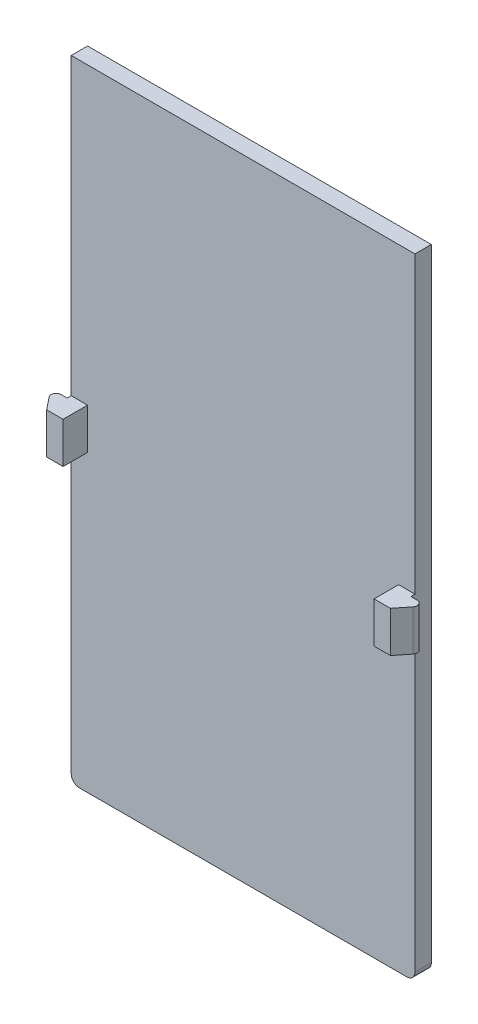
ISO-10303-21;
HEADER;
FILE_DESCRIPTION(('STEP AP214'),'2;1');
FILE_NAME('part.step','',(''),(''),'','','');
FILE_SCHEMA(('AUTOMOTIVE_DESIGN { 1 0 10303 214 1 1 1 1 }'));
ENDSEC;
DATA;
#1=APPLICATION_CONTEXT('core data for automotive mechanical design processes');
#2=APPLICATION_PROTOCOL_DEFINITION('international standard','automotive_design',2000,#1);
#3=PRODUCT_CONTEXT('',#1,'mechanical');
#4=PRODUCT('Part','Part','',(#3));
#5=PRODUCT_RELATED_PRODUCT_CATEGORY('part','',(#4));
#6=PRODUCT_DEFINITION_FORMATION('','',#4);
#7=PRODUCT_DEFINITION_CONTEXT('part definition',#1,'design');
#8=PRODUCT_DEFINITION('design','',#6,#7);
#9=PRODUCT_DEFINITION_SHAPE('','',#8);
#10=(LENGTH_UNIT() NAMED_UNIT(*) SI_UNIT(.MILLI.,.METRE.));
#11=(NAMED_UNIT(*) PLANE_ANGLE_UNIT() SI_UNIT($,.RADIAN.));
#12=(NAMED_UNIT(*) SI_UNIT($,.STERADIAN.) SOLID_ANGLE_UNIT());
#13=UNCERTAINTY_MEASURE_WITH_UNIT(LENGTH_MEASURE(1.E-05),#10,'distance_accuracy_value','');
#14=(GEOMETRIC_REPRESENTATION_CONTEXT(3) GLOBAL_UNCERTAINTY_ASSIGNED_CONTEXT((#13)) GLOBAL_UNIT_ASSIGNED_CONTEXT((#10,
#11,#12)) REPRESENTATION_CONTEXT('',''));
#15=CARTESIAN_POINT('',(0.,0.,0.));
#16=DIRECTION('',(0.,0.,1.));
#17=DIRECTION('',(1.,0.,0.));
#18=AXIS2_PLACEMENT_3D('',#15,#16,#17);
#19=CARTESIAN_POINT('',(0.,0.,2.));
#20=DIRECTION('',(0.,0.,1.));
#21=DIRECTION('',(1.,0.,0.));
#22=AXIS2_PLACEMENT_3D('',#19,#20,#21);
#23=PLANE('',#22);
#24=DIRECTION('',(0.,-1.,0.));
#25=VECTOR('',#24,1.);
#26=CARTESIAN_POINT('',(2.,-2.,2.));
#27=LINE('',#26,#25);
#28=CARTESIAN_POINT('',(2.,-41.,2.));
#29=VERTEX_POINT('',#28);
#30=CARTESIAN_POINT('',(2.00000000000001,-76.,2.));
#31=VERTEX_POINT('',#30);
#32=EDGE_CURVE('E211',#29,#31,#27,.T.);
#33=ORIENTED_EDGE('',*,*,#32,.T.);
#34=CARTESIAN_POINT('',(3.00000000000004,-76.,2.));
#35=DIRECTION('',(0.,0.,1.));
#36=DIRECTION('',(1.,0.,0.));
#37=AXIS2_PLACEMENT_3D('',#34,#35,#36);
#38=CIRCLE('',#37,1.);
#39=CARTESIAN_POINT('',(3.00000000000004,-77.,2.));
#40=VERTEX_POINT('',#39);
#41=EDGE_CURVE('E278',#31,#40,#38,.T.);
#42=ORIENTED_EDGE('',*,*,#41,.T.);
#43=DIRECTION('',(1.,0.,0.));
#44=VECTOR('',#43,1.);
#45=CARTESIAN_POINT('',(2.00000000000001,-77.,2.));
#46=LINE('',#45,#44);
#47=CARTESIAN_POINT('',(43.,-77.,2.));
#48=VERTEX_POINT('',#47);
#49=EDGE_CURVE('E223',#40,#48,#46,.T.);
#50=ORIENTED_EDGE('',*,*,#49,.T.);
#51=CARTESIAN_POINT('',(43.,-76.,2.));
#52=DIRECTION('',(0.,0.,1.));
#53=DIRECTION('',(1.,0.,0.));
#54=AXIS2_PLACEMENT_3D('',#51,#52,#53);
#55=CIRCLE('',#54,1.);
#56=CARTESIAN_POINT('',(44.,-76.,2.));
#57=VERTEX_POINT('',#56);
#58=EDGE_CURVE('E276',#48,#57,#55,.T.);
#59=ORIENTED_EDGE('',*,*,#58,.T.);
#60=DIRECTION('',(0.,1.,0.));
#61=VECTOR('',#60,1.);
#62=CARTESIAN_POINT('',(44.,-2.,2.));
#63=LINE('',#62,#61);
#64=CARTESIAN_POINT('',(44.,-41.,2.));
#65=VERTEX_POINT('',#64);
#66=EDGE_CURVE('E227',#57,#65,#63,.T.);
#67=ORIENTED_EDGE('',*,*,#66,.T.);
#68=DIRECTION('',(1.,0.,0.));
#69=VECTOR('',#68,1.);
#70=CARTESIAN_POINT('',(42.,-41.,2.));
#71=LINE('',#70,#69);
#72=CARTESIAN_POINT('',(42.,-41.,2.));
#73=VERTEX_POINT('',#72);
#74=EDGE_CURVE('E239',#73,#65,#71,.T.);
#75=ORIENTED_EDGE('',*,*,#74,.F.);
#76=DIRECTION('',(0.,-1.,0.));
#77=VECTOR('',#76,1.);
#78=CARTESIAN_POINT('',(42.,-36.,2.));
#79=LINE('',#78,#77);
#80=CARTESIAN_POINT('',(42.,-36.,2.));
#81=VERTEX_POINT('',#80);
#82=EDGE_CURVE('E242',#81,#73,#79,.T.);
#83=ORIENTED_EDGE('',*,*,#82,.F.);
#84=DIRECTION('',(-1.,0.,0.));
#85=VECTOR('',#84,1.);
#86=CARTESIAN_POINT('',(42.,-36.,2.));
#87=LINE('',#86,#85);
#88=CARTESIAN_POINT('',(44.,-36.,2.));
#89=VERTEX_POINT('',#88);
#90=EDGE_CURVE('E188',#89,#81,#87,.T.);
#91=ORIENTED_EDGE('',*,*,#90,.F.);
#92=CARTESIAN_POINT('',(44.,0.,2.));
#93=VERTEX_POINT('',#92);
#94=EDGE_CURVE('E226',#89,#93,#63,.T.);
#95=ORIENTED_EDGE('',*,*,#94,.T.);
#96=DIRECTION('',(-1.,0.,0.));
#97=VECTOR('',#96,1.);
#98=CARTESIAN_POINT('',(2.,0.,2.));
#99=LINE('',#98,#97);
#100=CARTESIAN_POINT('',(2.,0.,2.));
#101=VERTEX_POINT('',#100);
#102=EDGE_CURVE('E207',#93,#101,#99,.T.);
#103=ORIENTED_EDGE('',*,*,#102,.T.);
#104=CARTESIAN_POINT('',(2.,-36.,2.));
#105=VERTEX_POINT('',#104);
#106=EDGE_CURVE('E220',#101,#105,#27,.T.);
#107=ORIENTED_EDGE('',*,*,#106,.T.);
#108=DIRECTION('',(-1.,0.,0.));
#109=VECTOR('',#108,1.);
#110=CARTESIAN_POINT('',(2.,-36.,2.));
#111=LINE('',#110,#109);
#112=CARTESIAN_POINT('',(4.00000000000001,-36.,2.));
#113=VERTEX_POINT('',#112);
#114=EDGE_CURVE('E250',#113,#105,#111,.T.);
#115=ORIENTED_EDGE('',*,*,#114,.F.);
#116=DIRECTION('',(0.,1.,0.));
#117=VECTOR('',#116,1.);
#118=CARTESIAN_POINT('',(4.00000000000001,-36.,2.));
#119=LINE('',#118,#117);
#120=CARTESIAN_POINT('',(4.00000000000001,-41.,2.));
#121=VERTEX_POINT('',#120);
#122=EDGE_CURVE('E253',#121,#113,#119,.T.);
#123=ORIENTED_EDGE('',*,*,#122,.F.);
#124=DIRECTION('',(1.,0.,0.));
#125=VECTOR('',#124,1.);
#126=CARTESIAN_POINT('',(2.00000000000001,-41.,2.));
#127=LINE('',#126,#125);
#128=EDGE_CURVE('E244',#29,#121,#127,.T.);
#129=ORIENTED_EDGE('',*,*,#128,.F.);
#130=EDGE_LOOP('',(#33,#42,#50,#59,#67,#75,#83,#91,#95,#103,#107,#115,#123,#129));
#131=FACE_BOUND('',#130,.T.);
#132=ADVANCED_FACE('F41',(#131),#23,.T.);
#133=CARTESIAN_POINT('',(2.,-36.,5.));
#134=DIRECTION('',(1.,0.,0.));
#135=DIRECTION('',(0.,1.,0.));
#136=AXIS2_PLACEMENT_3D('',#133,#134,#135);
#137=PLANE('',#136);
#138=DIRECTION('',(0.,0.,-1.));
#139=VECTOR('',#138,1.);
#140=CARTESIAN_POINT('',(2.00000000000001,-41.,5.));
#141=LINE('',#140,#139);
#142=CARTESIAN_POINT('',(2.,-41.,2.5));
#143=VERTEX_POINT('',#142);
#144=EDGE_CURVE('E263',#143,#29,#141,.T.);
#145=ORIENTED_EDGE('',*,*,#144,.F.);
#146=DIRECTION('',(0.,1.,0.));
#147=VECTOR('',#146,1.);
#148=CARTESIAN_POINT('',(2.,-36.,2.5));
#149=LINE('',#148,#147);
#150=CARTESIAN_POINT('',(2.,-36.,2.5));
#151=VERTEX_POINT('',#150);
#152=EDGE_CURVE('E198',#143,#151,#149,.T.);
#153=ORIENTED_EDGE('',*,*,#152,.T.);
#154=DIRECTION('',(0.,0.,-1.));
#155=VECTOR('',#154,1.);
#156=CARTESIAN_POINT('',(2.,-36.,5.));
#157=LINE('',#156,#155);
#158=EDGE_CURVE('E249',#151,#105,#157,.T.);
#159=ORIENTED_EDGE('',*,*,#158,.T.);
#160=ORIENTED_EDGE('',*,*,#106,.F.);
#161=DIRECTION('',(0.,0.,1.));
#162=VECTOR('',#161,1.);
#163=CARTESIAN_POINT('',(2.,0.,-42.0119030752));
#164=LINE('',#163,#162);
#165=CARTESIAN_POINT('',(2.,0.,0.));
#166=VERTEX_POINT('',#165);
#167=EDGE_CURVE('E212',#166,#101,#164,.T.);
#168=ORIENTED_EDGE('',*,*,#167,.F.);
#169=DIRECTION('',(0.,-1.,0.));
#170=VECTOR('',#169,1.);
#171=CARTESIAN_POINT('',(2.,0.,0.));
#172=LINE('',#171,#170);
#173=CARTESIAN_POINT('',(2.00000000000001,-76.,0.));
#174=VERTEX_POINT('',#173);
#175=EDGE_CURVE('E270',#166,#174,#172,.T.);
#176=ORIENTED_EDGE('',*,*,#175,.T.);
#177=DIRECTION('',(0.,0.,1.));
#178=VECTOR('',#177,1.);
#179=CARTESIAN_POINT('',(2.00000000000004,-76.,2.));
#180=LINE('',#179,#178);
#181=EDGE_CURVE('E273',#174,#31,#180,.T.);
#182=ORIENTED_EDGE('',*,*,#181,.T.);
#183=ORIENTED_EDGE('',*,*,#32,.F.);
#184=EDGE_LOOP('',(#145,#153,#159,#160,#168,#176,#182,#183));
#185=FACE_BOUND('',#184,.T.);
#186=ADVANCED_FACE('F365',(#185),#137,.F.);
#187=CARTESIAN_POINT('',(2.00000000000001,-41.,5.));
#188=DIRECTION('',(0.,1.,0.));
#189=DIRECTION('',(0.,0.,1.));
#190=AXIS2_PLACEMENT_3D('',#187,#188,#189);
#191=PLANE('',#190);
#192=DIRECTION('',(-0.624695047554426,0.,-0.780868809443029));
#193=VECTOR('',#192,1.);
#194=CARTESIAN_POINT('',(2.00000000000001,-41.,5.));
#195=LINE('',#194,#193);
#196=CARTESIAN_POINT('',(2.00000000000001,-41.,5.));
#197=VERTEX_POINT('',#196);
#198=CARTESIAN_POINT('',(0.779853622826126,-41.,3.47481702853265));
#199=VERTEX_POINT('',#198);
#200=EDGE_CURVE('E315',#197,#199,#195,.T.);
#201=ORIENTED_EDGE('',*,*,#200,.T.);
#202=CARTESIAN_POINT('',(1.24837490849194,-41.,3.1));
#203=DIRECTION('',(0.,1.,0.));
#204=DIRECTION('',(0.,0.,1.));
#205=AXIS2_PLACEMENT_3D('',#202,#203,#204);
#206=CIRCLE('',#205,0.6);
#207=CARTESIAN_POINT('',(1.24837490849194,-41.,2.5));
#208=VERTEX_POINT('',#207);
#209=EDGE_CURVE('E294',#199,#208,#206,.F.);
#210=ORIENTED_EDGE('',*,*,#209,.T.);
#211=DIRECTION('',(1.,0.,0.));
#212=VECTOR('',#211,1.);
#213=CARTESIAN_POINT('',(0.,-41.,2.5));
#214=LINE('',#213,#212);
#215=EDGE_CURVE('E324',#208,#143,#214,.T.);
#216=ORIENTED_EDGE('',*,*,#215,.T.);
#217=ORIENTED_EDGE('',*,*,#144,.T.);
#218=ORIENTED_EDGE('',*,*,#128,.T.);
#219=DIRECTION('',(0.,0.,-1.));
#220=VECTOR('',#219,1.);
#221=CARTESIAN_POINT('',(4.00000000000001,-41.,5.));
#222=LINE('',#221,#220);
#223=CARTESIAN_POINT('',(4.00000000000001,-41.,5.));
#224=VERTEX_POINT('',#223);
#225=EDGE_CURVE('E261',#224,#121,#222,.T.);
#226=ORIENTED_EDGE('',*,*,#225,.F.);
#227=DIRECTION('',(1.,0.,0.));
#228=VECTOR('',#227,1.);
#229=CARTESIAN_POINT('',(4.00000000000001,-41.,5.));
#230=LINE('',#229,#228);
#231=EDGE_CURVE('E194',#197,#224,#230,.T.);
#232=ORIENTED_EDGE('',*,*,#231,.F.);
#233=EDGE_LOOP('',(#201,#210,#216,#217,#218,#226,#232));
#234=FACE_BOUND('',#233,.T.);
#235=ADVANCED_FACE('F339',(#234),#191,.F.);
#236=CARTESIAN_POINT('',(4.00000000000001,-36.,5.));
#237=DIRECTION('',(-1.,0.,0.));
#238=DIRECTION('',(0.,-1.,0.));
#239=AXIS2_PLACEMENT_3D('',#236,#237,#238);
#240=PLANE('',#239);
#241=ORIENTED_EDGE('',*,*,#122,.T.);
#242=DIRECTION('',(0.,0.,-1.));
#243=VECTOR('',#242,1.);
#244=CARTESIAN_POINT('',(4.00000000000001,-36.,5.));
#245=LINE('',#244,#243);
#246=CARTESIAN_POINT('',(4.00000000000001,-36.,5.));
#247=VERTEX_POINT('',#246);
#248=EDGE_CURVE('E259',#247,#113,#245,.T.);
#249=ORIENTED_EDGE('',*,*,#248,.F.);
#250=DIRECTION('',(0.,-1.,0.));
#251=VECTOR('',#250,1.);
#252=CARTESIAN_POINT('',(4.00000000000001,-31.,5.));
#253=LINE('',#252,#251);
#254=EDGE_CURVE('E196',#247,#224,#253,.T.);
#255=ORIENTED_EDGE('',*,*,#254,.T.);
#256=ORIENTED_EDGE('',*,*,#225,.T.);
#257=EDGE_LOOP('',(#241,#249,#255,#256));
#258=FACE_BOUND('',#257,.T.);
#259=ADVANCED_FACE('F334',(#258),#240,.F.);
#260=CARTESIAN_POINT('',(2.,-36.,5.));
#261=DIRECTION('',(0.,-1.,0.));
#262=DIRECTION('',(0.,0.,-1.));
#263=AXIS2_PLACEMENT_3D('',#260,#261,#262);
#264=PLANE('',#263);
#265=DIRECTION('',(-1.,0.,0.));
#266=VECTOR('',#265,1.);
#267=CARTESIAN_POINT('',(0.,-36.,2.5));
#268=LINE('',#267,#266);
#269=CARTESIAN_POINT('',(1.24837490849194,-36.,2.5));
#270=VERTEX_POINT('',#269);
#271=EDGE_CURVE('E320',#151,#270,#268,.T.);
#272=ORIENTED_EDGE('',*,*,#271,.T.);
#273=CARTESIAN_POINT('',(1.24837490849194,-36.,3.1));
#274=DIRECTION('',(0.,-1.,0.));
#275=DIRECTION('',(0.,0.,-1.));
#276=AXIS2_PLACEMENT_3D('',#273,#274,#275);
#277=CIRCLE('',#276,0.6);
#278=CARTESIAN_POINT('',(0.779853622826126,-36.,3.47481702853265));
#279=VERTEX_POINT('',#278);
#280=EDGE_CURVE('E298',#270,#279,#277,.F.);
#281=ORIENTED_EDGE('',*,*,#280,.T.);
#282=DIRECTION('',(0.624695047554426,0.,0.780868809443029));
#283=VECTOR('',#282,1.);
#284=CARTESIAN_POINT('',(2.00000000000001,-36.,5.));
#285=LINE('',#284,#283);
#286=CARTESIAN_POINT('',(2.00000000000001,-36.,5.));
#287=VERTEX_POINT('',#286);
#288=EDGE_CURVE('E323',#279,#287,#285,.T.);
#289=ORIENTED_EDGE('',*,*,#288,.T.);
#290=DIRECTION('',(1.,0.,0.));
#291=VECTOR('',#290,1.);
#292=CARTESIAN_POINT('',(2.,-36.,5.));
#293=LINE('',#292,#291);
#294=EDGE_CURVE('E202',#287,#247,#293,.T.);
#295=ORIENTED_EDGE('',*,*,#294,.T.);
#296=ORIENTED_EDGE('',*,*,#248,.T.);
#297=ORIENTED_EDGE('',*,*,#114,.T.);
#298=ORIENTED_EDGE('',*,*,#158,.F.);
#299=EDGE_LOOP('',(#272,#281,#289,#295,#296,#297,#298));
#300=FACE_BOUND('',#299,.T.);
#301=ADVANCED_FACE('F349',(#300),#264,.F.);
#302=CARTESIAN_POINT('',(42.,-36.,5.));
#303=DIRECTION('',(1.,0.,0.));
#304=DIRECTION('',(0.,1.,0.));
#305=AXIS2_PLACEMENT_3D('',#302,#303,#304);
#306=PLANE('',#305);
#307=ORIENTED_EDGE('',*,*,#82,.T.);
#308=DIRECTION('',(0.,0.,-1.));
#309=VECTOR('',#308,1.);
#310=CARTESIAN_POINT('',(42.,-41.,5.));
#311=LINE('',#310,#309);
#312=CARTESIAN_POINT('',(42.,-41.,5.));
#313=VERTEX_POINT('',#312);
#314=EDGE_CURVE('E230',#313,#73,#311,.T.);
#315=ORIENTED_EDGE('',*,*,#314,.F.);
#316=DIRECTION('',(0.,-1.,0.));
#317=VECTOR('',#316,1.);
#318=CARTESIAN_POINT('',(42.,-31.,5.));
#319=LINE('',#318,#317);
#320=CARTESIAN_POINT('',(42.,-36.,5.));
#321=VERTEX_POINT('',#320);
#322=EDGE_CURVE('E193',#321,#313,#319,.T.);
#323=ORIENTED_EDGE('',*,*,#322,.F.);
#324=DIRECTION('',(0.,0.,-1.));
#325=VECTOR('',#324,1.);
#326=CARTESIAN_POINT('',(42.,-36.,5.));
#327=LINE('',#326,#325);
#328=EDGE_CURVE('E189',#321,#81,#327,.T.);
#329=ORIENTED_EDGE('',*,*,#328,.T.);
#330=EDGE_LOOP('',(#307,#315,#323,#329));
#331=FACE_BOUND('',#330,.T.);
#332=ADVANCED_FACE('F431',(#331),#306,.F.);
#333=CARTESIAN_POINT('',(42.,-41.,5.));
#334=DIRECTION('',(0.,1.,0.));
#335=DIRECTION('',(0.,0.,1.));
#336=AXIS2_PLACEMENT_3D('',#333,#334,#335);
#337=PLANE('',#336);
#338=DIRECTION('',(1.,0.,0.));
#339=VECTOR('',#338,1.);
#340=CARTESIAN_POINT('',(42.,-41.,2.5));
#341=LINE('',#340,#339);
#342=CARTESIAN_POINT('',(44.,-41.,2.5));
#343=VERTEX_POINT('',#342);
#344=CARTESIAN_POINT('',(44.7516250915081,-41.,2.5));
#345=VERTEX_POINT('',#344);
#346=EDGE_CURVE('E180',#343,#345,#341,.T.);
#347=ORIENTED_EDGE('',*,*,#346,.T.);
#348=CARTESIAN_POINT('',(44.7516250915081,-41.,3.1));
#349=DIRECTION('',(0.,1.,0.));
#350=DIRECTION('',(0.,0.,1.));
#351=AXIS2_PLACEMENT_3D('',#348,#349,#350);
#352=CIRCLE('',#351,0.6);
#353=CARTESIAN_POINT('',(45.2201463771739,-41.,3.47481702853265));
#354=VERTEX_POINT('',#353);
#355=EDGE_CURVE('E63',#345,#354,#352,.F.);
#356=ORIENTED_EDGE('',*,*,#355,.T.);
#357=DIRECTION('',(-0.624695047554425,0.,0.78086880944303));
#358=VECTOR('',#357,1.);
#359=CARTESIAN_POINT('',(46.,-41.,2.5));
#360=LINE('',#359,#358);
#361=CARTESIAN_POINT('',(44.,-41.,5.));
#362=VERTEX_POINT('',#361);
#363=EDGE_CURVE('E174',#354,#362,#360,.T.);
#364=ORIENTED_EDGE('',*,*,#363,.T.);
#365=DIRECTION('',(1.,0.,0.));
#366=VECTOR('',#365,1.);
#367=CARTESIAN_POINT('',(42.,-41.,5.));
#368=LINE('',#367,#366);
#369=EDGE_CURVE('E178',#313,#362,#368,.T.);
#370=ORIENTED_EDGE('',*,*,#369,.F.);
#371=ORIENTED_EDGE('',*,*,#314,.T.);
#372=ORIENTED_EDGE('',*,*,#74,.T.);
#373=DIRECTION('',(0.,0.,-1.));
#374=VECTOR('',#373,1.);
#375=CARTESIAN_POINT('',(44.,-41.,5.));
#376=LINE('',#375,#374);
#377=EDGE_CURVE('E232',#343,#65,#376,.T.);
#378=ORIENTED_EDGE('',*,*,#377,.F.);
#379=EDGE_LOOP('',(#347,#356,#364,#370,#371,#372,#378));
#380=FACE_BOUND('',#379,.T.);
#381=ADVANCED_FACE('F176',(#380),#337,.F.);
#382=CARTESIAN_POINT('',(44.,-36.,5.));
#383=DIRECTION('',(-1.,0.,0.));
#384=DIRECTION('',(0.,0.,1.));
#385=AXIS2_PLACEMENT_3D('',#382,#383,#384);
#386=PLANE('',#385);
#387=DIRECTION('',(0.,0.,-1.));
#388=VECTOR('',#387,1.);
#389=CARTESIAN_POINT('',(44.,-36.,5.));
#390=LINE('',#389,#388);
#391=CARTESIAN_POINT('',(44.,-36.,2.5));
#392=VERTEX_POINT('',#391);
#393=EDGE_CURVE('E234',#392,#89,#390,.T.);
#394=ORIENTED_EDGE('',*,*,#393,.F.);
#395=DIRECTION('',(0.,-1.,0.));
#396=VECTOR('',#395,1.);
#397=CARTESIAN_POINT('',(44.,-36.,2.5));
#398=LINE('',#397,#396);
#399=EDGE_CURVE('E313',#392,#343,#398,.T.);
#400=ORIENTED_EDGE('',*,*,#399,.T.);
#401=ORIENTED_EDGE('',*,*,#377,.T.);
#402=ORIENTED_EDGE('',*,*,#66,.F.);
#403=DIRECTION('',(0.,0.,1.));
#404=VECTOR('',#403,1.);
#405=CARTESIAN_POINT('',(44.,-76.,0.));
#406=LINE('',#405,#404);
#407=CARTESIAN_POINT('',(44.,-76.,0.));
#408=VERTEX_POINT('',#407);
#409=EDGE_CURVE('E289',#57,#408,#406,.F.);
#410=ORIENTED_EDGE('',*,*,#409,.T.);
#411=DIRECTION('',(0.,1.,0.));
#412=VECTOR('',#411,1.);
#413=CARTESIAN_POINT('',(44.,0.,0.));
#414=LINE('',#413,#412);
#415=CARTESIAN_POINT('',(44.,0.,0.));
#416=VERTEX_POINT('',#415);
#417=EDGE_CURVE('E268',#408,#416,#414,.T.);
#418=ORIENTED_EDGE('',*,*,#417,.T.);
#419=DIRECTION('',(0.,0.,1.));
#420=VECTOR('',#419,1.);
#421=CARTESIAN_POINT('',(44.,0.,-42.0119030752));
#422=LINE('',#421,#420);
#423=EDGE_CURVE('E215',#416,#93,#422,.T.);
#424=ORIENTED_EDGE('',*,*,#423,.T.);
#425=ORIENTED_EDGE('',*,*,#94,.F.);
#426=EDGE_LOOP('',(#394,#400,#401,#402,#410,#418,#424,#425));
#427=FACE_BOUND('',#426,.T.);
#428=ADVANCED_FACE('F389',(#427),#386,.F.);
#429=CARTESIAN_POINT('',(42.,-36.,5.));
#430=DIRECTION('',(0.,-1.,0.));
#431=DIRECTION('',(0.,0.,-1.));
#432=AXIS2_PLACEMENT_3D('',#429,#430,#431);
#433=PLANE('',#432);
#434=DIRECTION('',(0.624695047554425,0.,-0.78086880944303));
#435=VECTOR('',#434,1.);
#436=CARTESIAN_POINT('',(46.,-36.,2.5));
#437=LINE('',#436,#435);
#438=CARTESIAN_POINT('',(44.,-36.,5.));
#439=VERTEX_POINT('',#438);
#440=CARTESIAN_POINT('',(45.2201463771739,-36.,3.47481702853265));
#441=VERTEX_POINT('',#440);
#442=EDGE_CURVE('E181',#439,#441,#437,.T.);
#443=ORIENTED_EDGE('',*,*,#442,.T.);
#444=CARTESIAN_POINT('',(44.7516250915081,-36.,3.1));
#445=DIRECTION('',(0.,-1.,0.));
#446=DIRECTION('',(0.,0.,-1.));
#447=AXIS2_PLACEMENT_3D('',#444,#445,#446);
#448=CIRCLE('',#447,0.6);
#449=CARTESIAN_POINT('',(44.7516250915081,-36.,2.5));
#450=VERTEX_POINT('',#449);
#451=EDGE_CURVE('E11',#441,#450,#448,.F.);
#452=ORIENTED_EDGE('',*,*,#451,.T.);
#453=DIRECTION('',(-1.,0.,0.));
#454=VECTOR('',#453,1.);
#455=CARTESIAN_POINT('',(42.,-36.,2.5));
#456=LINE('',#455,#454);
#457=EDGE_CURVE('E309',#450,#392,#456,.T.);
#458=ORIENTED_EDGE('',*,*,#457,.T.);
#459=ORIENTED_EDGE('',*,*,#393,.T.);
#460=ORIENTED_EDGE('',*,*,#90,.T.);
#461=ORIENTED_EDGE('',*,*,#328,.F.);
#462=DIRECTION('',(1.,0.,0.));
#463=VECTOR('',#462,1.);
#464=CARTESIAN_POINT('',(42.,-36.,5.));
#465=LINE('',#464,#463);
#466=EDGE_CURVE('E205',#321,#439,#465,.T.);
#467=ORIENTED_EDGE('',*,*,#466,.T.);
#468=EDGE_LOOP('',(#443,#452,#458,#459,#460,#461,#467));
#469=FACE_BOUND('',#468,.T.);
#470=ADVANCED_FACE('F398',(#469),#433,.F.);
#471=CARTESIAN_POINT('',(2.00000000000001,-77.,-8.));
#472=DIRECTION('',(0.,-1.,0.));
#473=DIRECTION('',(0.,0.,-1.));
#474=AXIS2_PLACEMENT_3D('',#471,#472,#473);
#475=PLANE('',#474);
#476=ORIENTED_EDGE('',*,*,#49,.F.);
#477=DIRECTION('',(0.,0.,1.));
#478=VECTOR('',#477,1.);
#479=CARTESIAN_POINT('',(3.00000000000004,-77.,0.));
#480=LINE('',#479,#478);
#481=CARTESIAN_POINT('',(3.00000000000004,-77.,0.));
#482=VERTEX_POINT('',#481);
#483=EDGE_CURVE('E283',#40,#482,#480,.F.);
#484=ORIENTED_EDGE('',*,*,#483,.T.);
#485=DIRECTION('',(1.,0.,0.));
#486=VECTOR('',#485,1.);
#487=CARTESIAN_POINT('',(0.,-77.,0.));
#488=LINE('',#487,#486);
#489=CARTESIAN_POINT('',(43.,-77.,0.));
#490=VERTEX_POINT('',#489);
#491=EDGE_CURVE('E265',#482,#490,#488,.T.);
#492=ORIENTED_EDGE('',*,*,#491,.T.);
#493=DIRECTION('',(0.,0.,1.));
#494=VECTOR('',#493,1.);
#495=CARTESIAN_POINT('',(43.,-77.,2.));
#496=LINE('',#495,#494);
#497=EDGE_CURVE('E280',#490,#48,#496,.T.);
#498=ORIENTED_EDGE('',*,*,#497,.T.);
#499=EDGE_LOOP('',(#476,#484,#492,#498));
#500=FACE_BOUND('',#499,.T.);
#501=ADVANCED_FACE('F371',(#500),#475,.T.);
#502=CARTESIAN_POINT('',(0.,0.,0.));
#503=DIRECTION('',(0.,0.,1.));
#504=DIRECTION('',(1.,0.,0.));
#505=AXIS2_PLACEMENT_3D('',#502,#503,#504);
#506=PLANE('',#505);
#507=ORIENTED_EDGE('',*,*,#491,.F.);
#508=CARTESIAN_POINT('',(3.00000000000004,-76.,0.));
#509=DIRECTION('',(0.,0.,1.));
#510=DIRECTION('',(1.,0.,0.));
#511=AXIS2_PLACEMENT_3D('',#508,#509,#510);
#512=CIRCLE('',#511,1.);
#513=EDGE_CURVE('E287',#482,#174,#512,.F.);
#514=ORIENTED_EDGE('',*,*,#513,.T.);
#515=ORIENTED_EDGE('',*,*,#175,.F.);
#516=DIRECTION('',(1.,0.,0.));
#517=VECTOR('',#516,1.);
#518=CARTESIAN_POINT('',(2.,0.,0.));
#519=LINE('',#518,#517);
#520=EDGE_CURVE('E208',#166,#416,#519,.T.);
#521=ORIENTED_EDGE('',*,*,#520,.T.);
#522=ORIENTED_EDGE('',*,*,#417,.F.);
#523=CARTESIAN_POINT('',(43.,-76.,0.));
#524=DIRECTION('',(0.,0.,1.));
#525=DIRECTION('',(1.,0.,0.));
#526=AXIS2_PLACEMENT_3D('',#523,#524,#525);
#527=CIRCLE('',#526,1.);
#528=EDGE_CURVE('E285',#408,#490,#527,.F.);
#529=ORIENTED_EDGE('',*,*,#528,.T.);
#530=EDGE_LOOP('',(#507,#514,#515,#521,#522,#529));
#531=FACE_BOUND('',#530,.T.);
#532=ADVANCED_FACE('F377',(#531),#506,.F.);
#533=CARTESIAN_POINT('',(2.,0.,-42.0119030752));
#534=DIRECTION('',(0.,1.,0.));
#535=DIRECTION('',(0.,0.,1.));
#536=AXIS2_PLACEMENT_3D('',#533,#534,#535);
#537=PLANE('',#536);
#538=ORIENTED_EDGE('',*,*,#520,.F.);
#539=ORIENTED_EDGE('',*,*,#167,.T.);
#540=ORIENTED_EDGE('',*,*,#102,.F.);
#541=ORIENTED_EDGE('',*,*,#423,.F.);
#542=EDGE_LOOP('',(#538,#539,#540,#541));
#543=FACE_BOUND('',#542,.T.);
#544=ADVANCED_FACE('F382',(#543),#537,.T.);
#545=CARTESIAN_POINT('',(3.00000000000004,-76.,5.));
#546=DIRECTION('',(0.,0.,-1.));
#547=DIRECTION('',(-1.,0.,0.));
#548=AXIS2_PLACEMENT_3D('',#545,#546,#547);
#549=CYLINDRICAL_SURFACE('',#548,1.);
#550=ORIENTED_EDGE('',*,*,#513,.F.);
#551=ORIENTED_EDGE('',*,*,#483,.F.);
#552=ORIENTED_EDGE('',*,*,#41,.F.);
#553=ORIENTED_EDGE('',*,*,#181,.F.);
#554=EDGE_LOOP('',(#550,#551,#552,#553));
#555=FACE_BOUND('',#554,.T.);
#556=ADVANCED_FACE('F375',(#555),#549,.T.);
#557=CARTESIAN_POINT('',(43.,-76.,-8.));
#558=DIRECTION('',(0.,0.,-1.));
#559=DIRECTION('',(-1.,0.,0.));
#560=AXIS2_PLACEMENT_3D('',#557,#558,#559);
#561=CYLINDRICAL_SURFACE('',#560,1.);
#562=ORIENTED_EDGE('',*,*,#528,.F.);
#563=ORIENTED_EDGE('',*,*,#409,.F.);
#564=ORIENTED_EDGE('',*,*,#58,.F.);
#565=ORIENTED_EDGE('',*,*,#497,.F.);
#566=EDGE_LOOP('',(#562,#563,#564,#565));
#567=FACE_BOUND('',#566,.T.);
#568=ADVANCED_FACE('F395',(#567),#561,.T.);
#569=CARTESIAN_POINT('',(42.,-31.,5.));
#570=DIRECTION('',(0.,0.,-1.));
#571=DIRECTION('',(-1.,0.,0.));
#572=AXIS2_PLACEMENT_3D('',#569,#570,#571);
#573=PLANE('',#572);
#574=ORIENTED_EDGE('',*,*,#466,.F.);
#575=ORIENTED_EDGE('',*,*,#322,.T.);
#576=ORIENTED_EDGE('',*,*,#369,.T.);
#577=DIRECTION('',(0.,1.,0.));
#578=VECTOR('',#577,1.);
#579=CARTESIAN_POINT('',(44.,-36.,5.));
#580=LINE('',#579,#578);
#581=EDGE_CURVE('E184',#362,#439,#580,.T.);
#582=ORIENTED_EDGE('',*,*,#581,.T.);
#583=EDGE_LOOP('',(#574,#575,#576,#582));
#584=FACE_BOUND('',#583,.T.);
#585=ADVANCED_FACE('F191',(#584),#573,.F.);
#586=CARTESIAN_POINT('',(4.00000000000001,-31.,5.));
#587=DIRECTION('',(0.,0.,-1.));
#588=DIRECTION('',(-1.,0.,0.));
#589=AXIS2_PLACEMENT_3D('',#586,#587,#588);
#590=PLANE('',#589);
#591=DIRECTION('',(0.,-1.,0.));
#592=VECTOR('',#591,1.);
#593=CARTESIAN_POINT('',(2.,-36.,5.));
#594=LINE('',#593,#592);
#595=EDGE_CURVE('E246',#287,#197,#594,.T.);
#596=ORIENTED_EDGE('',*,*,#595,.T.);
#597=ORIENTED_EDGE('',*,*,#231,.T.);
#598=ORIENTED_EDGE('',*,*,#254,.F.);
#599=ORIENTED_EDGE('',*,*,#294,.F.);
#600=EDGE_LOOP('',(#596,#597,#598,#599));
#601=FACE_BOUND('',#600,.T.);
#602=ADVANCED_FACE('F352',(#601),#590,.F.);
#603=CARTESIAN_POINT('',(0.,-31.2830094339717,2.5));
#604=DIRECTION('',(0.,0.,-1.));
#605=DIRECTION('',(-1.,0.,0.));
#606=AXIS2_PLACEMENT_3D('',#603,#604,#605);
#607=PLANE('',#606);
#608=ORIENTED_EDGE('',*,*,#215,.F.);
#609=DIRECTION('',(0.,-1.,0.));
#610=VECTOR('',#609,1.);
#611=CARTESIAN_POINT('',(1.24837490849194,-31.2830094339717,2.5));
#612=LINE('',#611,#610);
#613=EDGE_CURVE('E296',#208,#270,#612,.F.);
#614=ORIENTED_EDGE('',*,*,#613,.T.);
#615=ORIENTED_EDGE('',*,*,#271,.F.);
#616=ORIENTED_EDGE('',*,*,#152,.F.);
#617=EDGE_LOOP('',(#608,#614,#615,#616));
#618=FACE_BOUND('',#617,.T.);
#619=ADVANCED_FACE('F361',(#618),#607,.T.);
#620=CARTESIAN_POINT('',(2.00000000000001,-31.2830094339717,5.));
#621=DIRECTION('',(-0.780868809443029,0.,0.624695047554426));
#622=DIRECTION('',(0.624695047554426,0.,0.780868809443029));
#623=AXIS2_PLACEMENT_3D('',#620,#621,#622);
#624=PLANE('',#623);
#625=ORIENTED_EDGE('',*,*,#288,.F.);
#626=DIRECTION('',(0.,-1.,0.));
#627=VECTOR('',#626,1.);
#628=CARTESIAN_POINT('',(0.779853622826126,-31.2830094339717,3.47481702853265));
#629=LINE('',#628,#627);
#630=EDGE_CURVE('E291',#279,#199,#629,.T.);
#631=ORIENTED_EDGE('',*,*,#630,.T.);
#632=ORIENTED_EDGE('',*,*,#200,.F.);
#633=ORIENTED_EDGE('',*,*,#595,.F.);
#634=EDGE_LOOP('',(#625,#631,#632,#633));
#635=FACE_BOUND('',#634,.T.);
#636=ADVANCED_FACE('F354',(#635),#624,.T.);
#637=CARTESIAN_POINT('',(42.,-31.2830094339717,2.5));
#638=DIRECTION('',(0.,0.,-1.));
#639=DIRECTION('',(-1.,0.,0.));
#640=AXIS2_PLACEMENT_3D('',#637,#638,#639);
#641=PLANE('',#640);
#642=ORIENTED_EDGE('',*,*,#457,.F.);
#643=DIRECTION('',(0.,-1.,0.));
#644=VECTOR('',#643,1.);
#645=CARTESIAN_POINT('',(44.7516250915081,-31.2830094339717,2.5));
#646=LINE('',#645,#644);
#647=EDGE_CURVE('E300',#450,#345,#646,.T.);
#648=ORIENTED_EDGE('',*,*,#647,.T.);
#649=ORIENTED_EDGE('',*,*,#346,.F.);
#650=ORIENTED_EDGE('',*,*,#399,.F.);
#651=EDGE_LOOP('',(#642,#648,#649,#650));
#652=FACE_BOUND('',#651,.T.);
#653=ADVANCED_FACE('F306',(#652),#641,.T.);
#654=CARTESIAN_POINT('',(46.,-31.2830094339717,2.5));
#655=DIRECTION('',(0.78086880944303,0.,0.624695047554425));
#656=DIRECTION('',(0.624695047554425,0.,-0.78086880944303));
#657=AXIS2_PLACEMENT_3D('',#654,#655,#656);
#658=PLANE('',#657);
#659=ORIENTED_EDGE('',*,*,#363,.F.);
#660=DIRECTION('',(0.,-1.,0.));
#661=VECTOR('',#660,1.);
#662=CARTESIAN_POINT('',(45.2201463771739,-31.2830094339717,3.47481702853265));
#663=LINE('',#662,#661);
#664=EDGE_CURVE('E49',#354,#441,#663,.F.);
#665=ORIENTED_EDGE('',*,*,#664,.T.);
#666=ORIENTED_EDGE('',*,*,#442,.F.);
#667=ORIENTED_EDGE('',*,*,#581,.F.);
#668=EDGE_LOOP('',(#659,#665,#666,#667));
#669=FACE_BOUND('',#668,.T.);
#670=ADVANCED_FACE('F185',(#669),#658,.T.);
#671=CARTESIAN_POINT('',(1.24837490849194,-31.2830094339717,3.1));
#672=DIRECTION('',(0.,-1.,0.));
#673=DIRECTION('',(0.,0.,-1.));
#674=AXIS2_PLACEMENT_3D('',#671,#672,#673);
#675=CYLINDRICAL_SURFACE('',#674,0.6);
#676=ORIENTED_EDGE('',*,*,#280,.F.);
#677=ORIENTED_EDGE('',*,*,#613,.F.);
#678=ORIENTED_EDGE('',*,*,#209,.F.);
#679=ORIENTED_EDGE('',*,*,#630,.F.);
#680=EDGE_LOOP('',(#676,#677,#678,#679));
#681=FACE_BOUND('',#680,.T.);
#682=ADVANCED_FACE('F363',(#681),#675,.T.);
#683=CARTESIAN_POINT('',(44.7516250915081,-31.2830094339717,3.1));
#684=DIRECTION('',(0.,-1.,0.));
#685=DIRECTION('',(0.,0.,-1.));
#686=AXIS2_PLACEMENT_3D('',#683,#684,#685);
#687=CYLINDRICAL_SURFACE('',#686,0.6);
#688=ORIENTED_EDGE('',*,*,#451,.F.);
#689=ORIENTED_EDGE('',*,*,#664,.F.);
#690=ORIENTED_EDGE('',*,*,#355,.F.);
#691=ORIENTED_EDGE('',*,*,#647,.F.);
#692=EDGE_LOOP('',(#688,#689,#690,#691));
#693=FACE_BOUND('',#692,.T.);
#694=ADVANCED_FACE('F43',(#693),#687,.T.);
#695=CLOSED_SHELL('',(#132,#186,#235,#259,#301,#332,#381,#428,#470,#501,#532,#544,#556,#568,
#585,#602,#619,#636,#653,#670,#682,#694));
#696=MANIFOLD_SOLID_BREP('B2',#695);
#697=ADVANCED_BREP_SHAPE_REPRESENTATION('',(#18,#696),#14);
#698=SHAPE_DEFINITION_REPRESENTATION(#9,#697);
ENDSEC;
END-ISO-10303-21;
